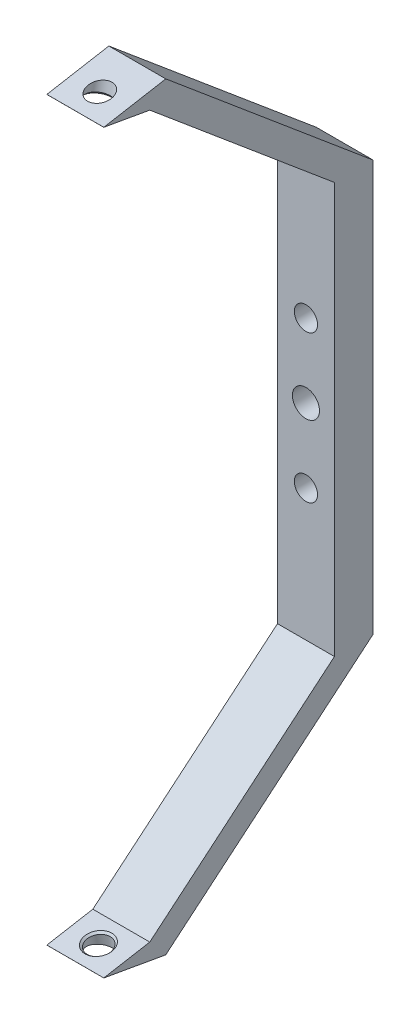
ISO-10303-21;
HEADER;
FILE_DESCRIPTION(('STEP AP214'),'2;1');
FILE_NAME('part.step','',(''),(''),'','','');
FILE_SCHEMA(('AUTOMOTIVE_DESIGN { 1 0 10303 214 1 1 1 1 }'));
ENDSEC;
DATA;
#1=APPLICATION_CONTEXT('core data for automotive mechanical design processes');
#2=APPLICATION_PROTOCOL_DEFINITION('international standard','automotive_design',2000,#1);
#3=PRODUCT_CONTEXT('',#1,'mechanical');
#4=PRODUCT('Part','Part','',(#3));
#5=PRODUCT_RELATED_PRODUCT_CATEGORY('part','',(#4));
#6=PRODUCT_DEFINITION_FORMATION('','',#4);
#7=PRODUCT_DEFINITION_CONTEXT('part definition',#1,'design');
#8=PRODUCT_DEFINITION('design','',#6,#7);
#9=PRODUCT_DEFINITION_SHAPE('','',#8);
#10=(LENGTH_UNIT() NAMED_UNIT(*) SI_UNIT(.MILLI.,.METRE.));
#11=(NAMED_UNIT(*) PLANE_ANGLE_UNIT() SI_UNIT($,.RADIAN.));
#12=(NAMED_UNIT(*) SI_UNIT($,.STERADIAN.) SOLID_ANGLE_UNIT());
#13=UNCERTAINTY_MEASURE_WITH_UNIT(LENGTH_MEASURE(1.E-05),#10,'distance_accuracy_value','');
#14=(GEOMETRIC_REPRESENTATION_CONTEXT(3) GLOBAL_UNCERTAINTY_ASSIGNED_CONTEXT((#13)) GLOBAL_UNIT_ASSIGNED_CONTEXT((#10,
#11,#12)) REPRESENTATION_CONTEXT('',''));
#15=CARTESIAN_POINT('',(0.,0.,0.));
#16=DIRECTION('',(0.,0.,1.));
#17=DIRECTION('',(1.,0.,0.));
#18=AXIS2_PLACEMENT_3D('',#15,#16,#17);
#19=CARTESIAN_POINT('',(3.675,26.5,5.));
#20=DIRECTION('',(-1.,0.,0.));
#21=DIRECTION('',(0.,-1.,0.));
#22=AXIS2_PLACEMENT_3D('',#19,#20,#21);
#23=PLANE('',#22);
#24=DIRECTION('',(0.,1.,0.));
#25=VECTOR('',#24,1.);
#26=CARTESIAN_POINT('',(3.675,26.5,0.));
#27=LINE('',#26,#25);
#28=CARTESIAN_POINT('',(3.675,-26.5,0.));
#29=VERTEX_POINT('',#28);
#30=CARTESIAN_POINT('',(3.675,26.5,0.));
#31=VERTEX_POINT('',#30);
#32=EDGE_CURVE('E241',#29,#31,#27,.T.);
#33=ORIENTED_EDGE('',*,*,#32,.T.);
#34=DIRECTION('',(0.,-0.64278760968654,-0.766044443118977));
#35=VECTOR('',#34,1.);
#36=CARTESIAN_POINT('',(3.675,15.5508383540868,-13.0487027274118));
#37=LINE('',#36,#35);
#38=CARTESIAN_POINT('',(3.67499999999999,48.9620193825305,26.7691922960515));
#39=VERTEX_POINT('',#38);
#40=EDGE_CURVE('E154',#39,#31,#37,.T.);
#41=ORIENTED_EDGE('',*,*,#40,.F.);
#42=DIRECTION('',(0.,0.173648177666936,-0.984807753012207));
#43=VECTOR('',#42,1.);
#44=CARTESIAN_POINT('',(3.67499999999999,52.0634353404395,9.18018835889042));
#45=LINE('',#44,#43);
#46=CARTESIAN_POINT('',(3.67499999999999,47.5514035368628,34.7691922960515));
#47=VERTEX_POINT('',#46);
#48=EDGE_CURVE('E158',#47,#39,#45,.T.);
#49=ORIENTED_EDGE('',*,*,#48,.F.);
#50=CARTESIAN_POINT('',(3.67499999999999,47.5488745389716,34.7687463654891));
#51=DIRECTION('',(1.,0.,0.));
#52=DIRECTION('',(0.,1.,0.));
#53=AXIS2_PLACEMENT_3D('',#50,#51,#52);
#54=CIRCLE('',#53,0.00256801176003775);
#55=CARTESIAN_POINT('',(3.67499999999999,47.5463455410805,34.7691922960515));
#56=VERTEX_POINT('',#55);
#57=EDGE_CURVE('E142',#56,#47,#54,.F.);
#58=ORIENTED_EDGE('',*,*,#57,.F.);
#59=DIRECTION('',(0.,-0.173648177666952,-0.984807753012204));
#60=VECTOR('',#59,1.);
#61=CARTESIAN_POINT('',(3.67499999999999,40.1667657294778,-7.08248452590395));
#62=LINE('',#61,#60);
#63=CARTESIAN_POINT('',(3.67499999999999,46.5,28.8350718518841));
#64=VERTEX_POINT('',#63);
#65=EDGE_CURVE('E146',#56,#64,#62,.T.);
#66=ORIENTED_EDGE('',*,*,#65,.T.);
#67=DIRECTION('',(0.,0.64278760968654,0.766044443118977));
#68=VECTOR('',#67,1.);
#69=CARTESIAN_POINT('',(3.675,13.0888189715563,-10.9828231715791));
#70=LINE('',#69,#68);
#71=CARTESIAN_POINT('',(3.675,26.5,5.));
#72=VERTEX_POINT('',#71);
#73=EDGE_CURVE('E151',#72,#64,#70,.T.);
#74=ORIENTED_EDGE('',*,*,#73,.F.);
#75=DIRECTION('',(0.,1.,0.));
#76=VECTOR('',#75,1.);
#77=CARTESIAN_POINT('',(3.675,26.5,5.));
#78=LINE('',#77,#76);
#79=CARTESIAN_POINT('',(3.675,-26.5,5.));
#80=VERTEX_POINT('',#79);
#81=EDGE_CURVE('E102',#80,#72,#78,.T.);
#82=ORIENTED_EDGE('',*,*,#81,.F.);
#83=DIRECTION('',(0.,-0.64278760968654,0.766044443118977));
#84=VECTOR('',#83,1.);
#85=CARTESIAN_POINT('',(3.67500000000001,-26.5,5.));
#86=LINE('',#85,#84);
#87=CARTESIAN_POINT('',(3.67500000000001,-46.5,28.8350718518841));
#88=VERTEX_POINT('',#87);
#89=EDGE_CURVE('E213',#80,#88,#86,.T.);
#90=ORIENTED_EDGE('',*,*,#89,.T.);
#91=DIRECTION('',(0.,0.173648177666952,-0.984807753012204));
#92=VECTOR('',#91,1.);
#93=CARTESIAN_POINT('',(3.675,-46.5,28.8350718518841));
#94=LINE('',#93,#92);
#95=CARTESIAN_POINT('',(3.675,-47.5463455410805,34.7691922960515));
#96=VERTEX_POINT('',#95);
#97=EDGE_CURVE('E188',#96,#88,#94,.T.);
#98=ORIENTED_EDGE('',*,*,#97,.F.);
#99=CARTESIAN_POINT('',(3.675,-47.5488745389716,34.7687463654891));
#100=DIRECTION('',(-1.,0.,0.));
#101=DIRECTION('',(0.,-1.,0.));
#102=AXIS2_PLACEMENT_3D('',#99,#100,#101);
#103=CIRCLE('',#102,0.00256801176003775);
#104=CARTESIAN_POINT('',(3.675,-47.5514035368628,34.7691922960515));
#105=VERTEX_POINT('',#104);
#106=EDGE_CURVE('E183',#105,#96,#103,.T.);
#107=ORIENTED_EDGE('',*,*,#106,.F.);
#108=DIRECTION('',(0.,-0.173648177666936,-0.984807753012207));
#109=VECTOR('',#108,1.);
#110=CARTESIAN_POINT('',(3.675,-48.9620193825305,26.7691922960515));
#111=LINE('',#110,#109);
#112=CARTESIAN_POINT('',(3.67500000000001,-48.9620193825305,26.7691922960515));
#113=VERTEX_POINT('',#112);
#114=EDGE_CURVE('E180',#105,#113,#111,.T.);
#115=ORIENTED_EDGE('',*,*,#114,.T.);
#116=DIRECTION('',(0.,0.64278760968654,-0.766044443118977));
#117=VECTOR('',#116,1.);
#118=CARTESIAN_POINT('',(3.67500000000001,-48.9620193825305,26.7691922960515));
#119=LINE('',#118,#117);
#120=EDGE_CURVE('E85',#113,#29,#119,.T.);
#121=ORIENTED_EDGE('',*,*,#120,.T.);
#122=EDGE_LOOP('',(#33,#41,#49,#58,#66,#74,#82,#90,#98,#107,#115,#121));
#123=FACE_BOUND('',#122,.T.);
#124=ADVANCED_FACE('F43',(#123),#23,.F.);
#125=CARTESIAN_POINT('',(-3.675,26.5,5.));
#126=DIRECTION('',(1.,0.,0.));
#127=DIRECTION('',(0.,1.,0.));
#128=AXIS2_PLACEMENT_3D('',#125,#126,#127);
#129=PLANE('',#128);
#130=DIRECTION('',(0.,-1.,0.));
#131=VECTOR('',#130,1.);
#132=CARTESIAN_POINT('',(-3.675,26.5,0.));
#133=LINE('',#132,#131);
#134=CARTESIAN_POINT('',(-3.675,26.5,0.));
#135=VERTEX_POINT('',#134);
#136=CARTESIAN_POINT('',(-3.675,-26.5,0.));
#137=VERTEX_POINT('',#136);
#138=EDGE_CURVE('E74',#135,#137,#133,.T.);
#139=ORIENTED_EDGE('',*,*,#138,.T.);
#140=DIRECTION('',(0.,0.64278760968654,-0.766044443118977));
#141=VECTOR('',#140,1.);
#142=CARTESIAN_POINT('',(-3.675,-48.9620193825305,26.7691922960515));
#143=LINE('',#142,#141);
#144=CARTESIAN_POINT('',(-3.675,-48.9620193825305,26.7691922960515));
#145=VERTEX_POINT('',#144);
#146=EDGE_CURVE('E192',#145,#137,#143,.T.);
#147=ORIENTED_EDGE('',*,*,#146,.F.);
#148=DIRECTION('',(0.,0.173648177666936,0.984807753012207));
#149=VECTOR('',#148,1.);
#150=CARTESIAN_POINT('',(-3.675,-48.9620193825305,26.7691922960515));
#151=LINE('',#150,#149);
#152=CARTESIAN_POINT('',(-3.675,-47.5514035368628,34.7691922960515));
#153=VERTEX_POINT('',#152);
#154=EDGE_CURVE('E200',#145,#153,#151,.T.);
#155=ORIENTED_EDGE('',*,*,#154,.T.);
#156=CARTESIAN_POINT('',(-3.675,-47.5488745389716,34.7687463654891));
#157=DIRECTION('',(1.,0.,0.));
#158=DIRECTION('',(0.,1.,0.));
#159=AXIS2_PLACEMENT_3D('',#156,#157,#158);
#160=CIRCLE('',#159,0.00256801176003775);
#161=CARTESIAN_POINT('',(-3.675,-47.5463455410805,34.7691922960515));
#162=VERTEX_POINT('',#161);
#163=EDGE_CURVE('E196',#162,#153,#160,.T.);
#164=ORIENTED_EDGE('',*,*,#163,.F.);
#165=DIRECTION('',(0.,-0.173648177666952,0.984807753012204));
#166=VECTOR('',#165,1.);
#167=CARTESIAN_POINT('',(-3.675,-46.5,28.8350718518841));
#168=LINE('',#167,#166);
#169=CARTESIAN_POINT('',(-3.675,-46.5,28.8350718518841));
#170=VERTEX_POINT('',#169);
#171=EDGE_CURVE('E179',#170,#162,#168,.T.);
#172=ORIENTED_EDGE('',*,*,#171,.F.);
#173=DIRECTION('',(0.,-0.64278760968654,0.766044443118977));
#174=VECTOR('',#173,1.);
#175=CARTESIAN_POINT('',(-3.675,-26.5,5.));
#176=LINE('',#175,#174);
#177=CARTESIAN_POINT('',(-3.675,-26.5,5.));
#178=VERTEX_POINT('',#177);
#179=EDGE_CURVE('E119',#178,#170,#176,.T.);
#180=ORIENTED_EDGE('',*,*,#179,.F.);
#181=DIRECTION('',(0.,-1.,0.));
#182=VECTOR('',#181,1.);
#183=CARTESIAN_POINT('',(-3.675,26.5,5.));
#184=LINE('',#183,#182);
#185=CARTESIAN_POINT('',(-3.675,26.5,5.));
#186=VERTEX_POINT('',#185);
#187=EDGE_CURVE('E101',#186,#178,#184,.T.);
#188=ORIENTED_EDGE('',*,*,#187,.F.);
#189=DIRECTION('',(0.,0.64278760968654,0.766044443118977));
#190=VECTOR('',#189,1.);
#191=CARTESIAN_POINT('',(-3.675,13.0888189715563,-10.9828231715791));
#192=LINE('',#191,#190);
#193=CARTESIAN_POINT('',(-3.67500000000001,46.5,28.8350718518841));
#194=VERTEX_POINT('',#193);
#195=EDGE_CURVE('E115',#186,#194,#192,.T.);
#196=ORIENTED_EDGE('',*,*,#195,.T.);
#197=DIRECTION('',(0.,-0.173648177666952,-0.984807753012204));
#198=VECTOR('',#197,1.);
#199=CARTESIAN_POINT('',(-3.67500000000001,40.1667657294778,-7.08248452590395));
#200=LINE('',#199,#198);
#201=CARTESIAN_POINT('',(-3.67500000000001,47.5463455410805,34.7691922960515));
#202=VERTEX_POINT('',#201);
#203=EDGE_CURVE('E128',#202,#194,#200,.T.);
#204=ORIENTED_EDGE('',*,*,#203,.F.);
#205=CARTESIAN_POINT('',(-3.67500000000001,47.5488745389716,34.7687463654891));
#206=DIRECTION('',(1.,0.,0.));
#207=DIRECTION('',(0.,1.,0.));
#208=AXIS2_PLACEMENT_3D('',#205,#206,#207);
#209=CIRCLE('',#208,0.00256801176003775);
#210=CARTESIAN_POINT('',(-3.67500000000001,47.5514035368628,34.7691922960515));
#211=VERTEX_POINT('',#210);
#212=EDGE_CURVE('E134',#202,#211,#209,.F.);
#213=ORIENTED_EDGE('',*,*,#212,.T.);
#214=DIRECTION('',(0.,0.173648177666936,-0.984807753012207));
#215=VECTOR('',#214,1.);
#216=CARTESIAN_POINT('',(-3.67500000000001,52.0634353404395,9.18018835889042));
#217=LINE('',#216,#215);
#218=CARTESIAN_POINT('',(-3.67500000000001,48.9620193825305,26.7691922960515));
#219=VERTEX_POINT('',#218);
#220=EDGE_CURVE('E132',#211,#219,#217,.T.);
#221=ORIENTED_EDGE('',*,*,#220,.T.);
#222=DIRECTION('',(0.,-0.64278760968654,-0.766044443118977));
#223=VECTOR('',#222,1.);
#224=CARTESIAN_POINT('',(-3.675,15.5508383540868,-13.0487027274118));
#225=LINE('',#224,#223);
#226=EDGE_CURVE('E127',#219,#135,#225,.T.);
#227=ORIENTED_EDGE('',*,*,#226,.T.);
#228=EDGE_LOOP('',(#139,#147,#155,#164,#172,#180,#188,#196,#204,#213,#221,#227));
#229=FACE_BOUND('',#228,.T.);
#230=ADVANCED_FACE('F112',(#229),#129,.F.);
#231=CARTESIAN_POINT('',(0.,0.,5.));
#232=DIRECTION('',(0.,0.,1.));
#233=DIRECTION('',(1.,0.,0.));
#234=AXIS2_PLACEMENT_3D('',#231,#232,#233);
#235=PLANE('',#234);
#236=CARTESIAN_POINT('',(0.,0.,5.));
#237=DIRECTION('',(0.,0.,1.));
#238=DIRECTION('',(1.,0.,0.));
#239=AXIS2_PLACEMENT_3D('',#236,#237,#238);
#240=CIRCLE('',#239,1.75);
#241=CARTESIAN_POINT('',(1.75,0.,5.));
#242=VERTEX_POINT('',#241);
#243=EDGE_CURVE('E228',#242,#242,#240,.T.);
#244=ORIENTED_EDGE('',*,*,#243,.F.);
#245=EDGE_LOOP('',(#244));
#246=FACE_BOUND('',#245,.T.);
#247=CARTESIAN_POINT('',(0.,9.50000000000002,5.));
#248=DIRECTION('',(0.,0.,-1.));
#249=DIRECTION('',(-1.,0.,0.));
#250=AXIS2_PLACEMENT_3D('',#247,#248,#249);
#251=CIRCLE('',#250,1.49999999999999);
#252=CARTESIAN_POINT('',(-1.49999999999998,9.50000000000002,5.));
#253=VERTEX_POINT('',#252);
#254=EDGE_CURVE('E237',#253,#253,#251,.T.);
#255=ORIENTED_EDGE('',*,*,#254,.T.);
#256=EDGE_LOOP('',(#255));
#257=FACE_BOUND('',#256,.T.);
#258=CARTESIAN_POINT('',(0.,-9.49999999999997,5.));
#259=DIRECTION('',(0.,0.,-1.));
#260=DIRECTION('',(-1.,0.,0.));
#261=AXIS2_PLACEMENT_3D('',#258,#259,#260);
#262=CIRCLE('',#261,1.5);
#263=CARTESIAN_POINT('',(-1.5,-9.49999999999997,5.));
#264=VERTEX_POINT('',#263);
#265=EDGE_CURVE('E246',#264,#264,#262,.T.);
#266=ORIENTED_EDGE('',*,*,#265,.T.);
#267=EDGE_LOOP('',(#266));
#268=FACE_BOUND('',#267,.T.);
#269=ORIENTED_EDGE('',*,*,#81,.T.);
#270=DIRECTION('',(-1.,0.,0.));
#271=VECTOR('',#270,1.);
#272=CARTESIAN_POINT('',(-3.675,26.5,5.));
#273=LINE('',#272,#271);
#274=EDGE_CURVE('E98',#72,#186,#273,.T.);
#275=ORIENTED_EDGE('',*,*,#274,.T.);
#276=ORIENTED_EDGE('',*,*,#187,.T.);
#277=DIRECTION('',(1.,0.,0.));
#278=VECTOR('',#277,1.);
#279=CARTESIAN_POINT('',(-3.675,-26.5,5.));
#280=LINE('',#279,#278);
#281=EDGE_CURVE('E62',#178,#80,#280,.T.);
#282=ORIENTED_EDGE('',*,*,#281,.T.);
#283=EDGE_LOOP('',(#269,#275,#276,#282));
#284=FACE_BOUND('',#283,.T.);
#285=ADVANCED_FACE('F100',(#246,#257,#268,#284),#235,.T.);
#286=CARTESIAN_POINT('',(0.,0.,0.));
#287=DIRECTION('',(0.,0.,1.));
#288=DIRECTION('',(1.,0.,0.));
#289=AXIS2_PLACEMENT_3D('',#286,#287,#288);
#290=PLANE('',#289);
#291=CARTESIAN_POINT('',(0.,0.,0.));
#292=DIRECTION('',(0.,0.,1.));
#293=DIRECTION('',(1.,0.,0.));
#294=AXIS2_PLACEMENT_3D('',#291,#292,#293);
#295=CIRCLE('',#294,1.75);
#296=CARTESIAN_POINT('',(1.75,0.,0.));
#297=VERTEX_POINT('',#296);
#298=EDGE_CURVE('E229',#297,#297,#295,.T.);
#299=ORIENTED_EDGE('',*,*,#298,.T.);
#300=EDGE_LOOP('',(#299));
#301=FACE_BOUND('',#300,.T.);
#302=CARTESIAN_POINT('',(0.,9.50000000000002,0.));
#303=DIRECTION('',(0.,0.,-1.));
#304=DIRECTION('',(-1.,0.,0.));
#305=AXIS2_PLACEMENT_3D('',#302,#303,#304);
#306=CIRCLE('',#305,1.49999999999999);
#307=CARTESIAN_POINT('',(-1.49999999999998,9.50000000000002,0.));
#308=VERTEX_POINT('',#307);
#309=EDGE_CURVE('E242',#308,#308,#306,.T.);
#310=ORIENTED_EDGE('',*,*,#309,.F.);
#311=EDGE_LOOP('',(#310));
#312=FACE_BOUND('',#311,.T.);
#313=CARTESIAN_POINT('',(0.,-9.49999999999997,0.));
#314=DIRECTION('',(0.,0.,-1.));
#315=DIRECTION('',(-1.,0.,0.));
#316=AXIS2_PLACEMENT_3D('',#313,#314,#315);
#317=CIRCLE('',#316,1.5);
#318=CARTESIAN_POINT('',(-1.5,-9.49999999999997,0.));
#319=VERTEX_POINT('',#318);
#320=EDGE_CURVE('E233',#319,#319,#317,.T.);
#321=ORIENTED_EDGE('',*,*,#320,.F.);
#322=EDGE_LOOP('',(#321));
#323=FACE_BOUND('',#322,.T.);
#324=ORIENTED_EDGE('',*,*,#32,.F.);
#325=DIRECTION('',(1.,0.,0.));
#326=VECTOR('',#325,1.);
#327=CARTESIAN_POINT('',(-3.675,-26.5,0.));
#328=LINE('',#327,#326);
#329=EDGE_CURVE('E254',#137,#29,#328,.T.);
#330=ORIENTED_EDGE('',*,*,#329,.F.);
#331=ORIENTED_EDGE('',*,*,#138,.F.);
#332=DIRECTION('',(-1.,0.,0.));
#333=VECTOR('',#332,1.);
#334=CARTESIAN_POINT('',(-3.675,26.5,0.));
#335=LINE('',#334,#333);
#336=EDGE_CURVE('E262',#31,#135,#335,.T.);
#337=ORIENTED_EDGE('',*,*,#336,.F.);
#338=EDGE_LOOP('',(#324,#330,#331,#337));
#339=FACE_BOUND('',#338,.T.);
#340=ADVANCED_FACE('F304',(#301,#312,#323,#339),#290,.F.);
#341=CARTESIAN_POINT('',(0.,-9.49999999999997,5.));
#342=DIRECTION('',(0.,0.,-1.));
#343=DIRECTION('',(-1.,0.,0.));
#344=AXIS2_PLACEMENT_3D('',#341,#342,#343);
#345=CYLINDRICAL_SURFACE('',#344,1.5);
#346=ORIENTED_EDGE('',*,*,#265,.F.);
#347=EDGE_LOOP('',(#346));
#348=FACE_BOUND('',#347,.T.);
#349=ORIENTED_EDGE('',*,*,#320,.T.);
#350=EDGE_LOOP('',(#349));
#351=FACE_BOUND('',#350,.T.);
#352=ADVANCED_FACE('F307',(#348,#351),#345,.F.);
#353=CARTESIAN_POINT('',(0.,9.50000000000002,5.));
#354=DIRECTION('',(0.,0.,-1.));
#355=DIRECTION('',(-1.,0.,0.));
#356=AXIS2_PLACEMENT_3D('',#353,#354,#355);
#357=CYLINDRICAL_SURFACE('',#356,1.49999999999999);
#358=ORIENTED_EDGE('',*,*,#254,.F.);
#359=EDGE_LOOP('',(#358));
#360=FACE_BOUND('',#359,.T.);
#361=ORIENTED_EDGE('',*,*,#309,.T.);
#362=EDGE_LOOP('',(#361));
#363=FACE_BOUND('',#362,.T.);
#364=ADVANCED_FACE('F314',(#360,#363),#357,.F.);
#365=CARTESIAN_POINT('',(0.,0.,0.));
#366=DIRECTION('',(0.,0.,1.));
#367=DIRECTION('',(1.,0.,0.));
#368=AXIS2_PLACEMENT_3D('',#365,#366,#367);
#369=CYLINDRICAL_SURFACE('',#368,1.75);
#370=ORIENTED_EDGE('',*,*,#298,.F.);
#371=EDGE_LOOP('',(#370));
#372=FACE_BOUND('',#371,.T.);
#373=ORIENTED_EDGE('',*,*,#243,.T.);
#374=EDGE_LOOP('',(#373));
#375=FACE_BOUND('',#374,.T.);
#376=ADVANCED_FACE('F318',(#372,#375),#369,.F.);
#377=CARTESIAN_POINT('',(3.67500000000001,-48.9620193825305,26.7691922960515));
#378=DIRECTION('',(0.,0.766044443118977,0.64278760968654));
#379=DIRECTION('',(0.,-0.64278760968654,0.766044443118977));
#380=AXIS2_PLACEMENT_3D('',#377,#378,#379);
#381=PLANE('',#380);
#382=ORIENTED_EDGE('',*,*,#146,.T.);
#383=ORIENTED_EDGE('',*,*,#329,.T.);
#384=ORIENTED_EDGE('',*,*,#120,.F.);
#385=DIRECTION('',(-1.,0.,0.));
#386=VECTOR('',#385,1.);
#387=CARTESIAN_POINT('',(3.67500000000001,-48.9620193825305,26.7691922960515));
#388=LINE('',#387,#386);
#389=EDGE_CURVE('E216',#113,#145,#388,.T.);
#390=ORIENTED_EDGE('',*,*,#389,.T.);
#391=EDGE_LOOP('',(#382,#383,#384,#390));
#392=FACE_BOUND('',#391,.T.);
#393=ADVANCED_FACE('F322',(#392),#381,.F.);
#394=CARTESIAN_POINT('',(3.67500000000001,-26.5,5.));
#395=DIRECTION('',(0.,-0.766044443118977,-0.64278760968654));
#396=DIRECTION('',(0.,0.64278760968654,-0.766044443118977));
#397=AXIS2_PLACEMENT_3D('',#394,#395,#396);
#398=PLANE('',#397);
#399=ORIENTED_EDGE('',*,*,#179,.T.);
#400=DIRECTION('',(-1.,0.,0.));
#401=VECTOR('',#400,1.);
#402=CARTESIAN_POINT('',(3.67500000000001,-46.5,28.8350718518841));
#403=LINE('',#402,#401);
#404=EDGE_CURVE('E224',#88,#170,#403,.T.);
#405=ORIENTED_EDGE('',*,*,#404,.F.);
#406=ORIENTED_EDGE('',*,*,#89,.F.);
#407=ORIENTED_EDGE('',*,*,#281,.F.);
#408=EDGE_LOOP('',(#399,#405,#406,#407));
#409=FACE_BOUND('',#408,.T.);
#410=ADVANCED_FACE('F326',(#409),#398,.F.);
#411=CARTESIAN_POINT('',(12.0473053720196,-46.5,28.8350718518841));
#412=DIRECTION('',(0.,-0.984807753012204,-0.173648177666952));
#413=DIRECTION('',(0.,0.173648177666952,-0.984807753012204));
#414=AXIS2_PLACEMENT_3D('',#411,#412,#413);
#415=PLANE('',#414);
#416=CARTESIAN_POINT('',(0.,-47.0209445330009,31.7894951109207));
#417=DIRECTION('',(0.,-0.984807753012204,-0.173648177666952));
#418=DIRECTION('',(0.,0.173648177666952,-0.984807753012204));
#419=AXIS2_PLACEMENT_3D('',#416,#417,#418);
#420=CIRCLE('',#419,1.74999999999894);
#421=CARTESIAN_POINT('',(0.,-46.7170602220839,30.0660815431504));
#422=VERTEX_POINT('',#421);
#423=EDGE_CURVE('E273',#422,#422,#420,.T.);
#424=ORIENTED_EDGE('',*,*,#423,.T.);
#425=EDGE_LOOP('',(#424));
#426=FACE_BOUND('',#425,.T.);
#427=DIRECTION('',(-1.,0.,0.));
#428=VECTOR('',#427,1.);
#429=CARTESIAN_POINT('',(12.0473053720196,-47.5463455410805,34.7691922960515));
#430=LINE('',#429,#428);
#431=EDGE_CURVE('E184',#96,#162,#430,.T.);
#432=ORIENTED_EDGE('',*,*,#431,.F.);
#433=ORIENTED_EDGE('',*,*,#97,.T.);
#434=ORIENTED_EDGE('',*,*,#404,.T.);
#435=ORIENTED_EDGE('',*,*,#171,.T.);
#436=EDGE_LOOP('',(#432,#433,#434,#435));
#437=FACE_BOUND('',#436,.T.);
#438=ADVANCED_FACE('F329',(#426,#437),#415,.F.);
#439=CARTESIAN_POINT('',(12.0473053720196,-47.5488745389716,34.7687463654891));
#440=DIRECTION('',(-1.,0.,0.));
#441=DIRECTION('',(0.,-1.,0.));
#442=AXIS2_PLACEMENT_3D('',#439,#440,#441);
#443=CYLINDRICAL_SURFACE('',#442,0.00256801176003775);
#444=DIRECTION('',(-1.,0.,0.));
#445=VECTOR('',#444,1.);
#446=CARTESIAN_POINT('',(12.0473053720196,-47.5514035368628,34.7691922960515));
#447=LINE('',#446,#445);
#448=EDGE_CURVE('E204',#105,#153,#447,.T.);
#449=ORIENTED_EDGE('',*,*,#448,.F.);
#450=ORIENTED_EDGE('',*,*,#106,.T.);
#451=ORIENTED_EDGE('',*,*,#431,.T.);
#452=ORIENTED_EDGE('',*,*,#163,.T.);
#453=EDGE_LOOP('',(#449,#450,#451,#452));
#454=FACE_BOUND('',#453,.T.);
#455=ADVANCED_FACE('F333',(#454),#443,.T.);
#456=CARTESIAN_POINT('',(12.0473053720196,-48.9620193825305,26.7691922960515));
#457=DIRECTION('',(0.,-0.984807753012207,0.173648177666936));
#458=DIRECTION('',(0.,-0.173648177666936,-0.984807753012207));
#459=AXIS2_PLACEMENT_3D('',#456,#457,#458);
#460=PLANE('',#459);
#461=CARTESIAN_POINT('',(0.,-48.1106859167488,31.5973443029714));
#462=DIRECTION('',(0.,-0.984807753012207,0.173648177666936));
#463=DIRECTION('',(0.,0.173648177666936,0.984807753012207));
#464=AXIS2_PLACEMENT_3D('',#461,#462,#463);
#465=ELLIPSE('',#464,1.59626665871387,1.5);
#466=CARTESIAN_POINT('',(0.,-47.8334971203926,33.1693600843477));
#467=VERTEX_POINT('',#466);
#468=EDGE_CURVE('E166',#467,#467,#465,.F.);
#469=ORIENTED_EDGE('',*,*,#468,.T.);
#470=EDGE_LOOP('',(#469));
#471=FACE_BOUND('',#470,.T.);
#472=ORIENTED_EDGE('',*,*,#114,.F.);
#473=ORIENTED_EDGE('',*,*,#448,.T.);
#474=ORIENTED_EDGE('',*,*,#154,.F.);
#475=ORIENTED_EDGE('',*,*,#389,.F.);
#476=EDGE_LOOP('',(#472,#473,#474,#475));
#477=FACE_BOUND('',#476,.T.);
#478=ADVANCED_FACE('F337',(#471,#477),#460,.T.);
#479=CARTESIAN_POINT('',(0.,-52.4229446759958,30.8369767359198));
#480=DIRECTION('',(0.,0.984807753012209,0.173648177666928));
#481=DIRECTION('',(0.,-0.173648177666928,0.984807753012209));
#482=AXIS2_PLACEMENT_3D('',#479,#480,#481);
#483=CYLINDRICAL_SURFACE('',#482,1.5);
#484=CARTESIAN_POINT('',(0.,-47.2671464712529,31.7460830665042));
#485=DIRECTION('',(0.,-0.984807753012209,-0.173648177666927));
#486=DIRECTION('',(0.,0.173648177666927,-0.984807753012209));
#487=AXIS2_PLACEMENT_3D('',#484,#485,#486);
#488=CIRCLE('',#487,1.5);
#489=CARTESIAN_POINT('',(0.,-47.0066742047525,30.2688714369859));
#490=VERTEX_POINT('',#489);
#491=EDGE_CURVE('E258',#490,#490,#488,.F.);
#492=ORIENTED_EDGE('',*,*,#491,.T.);
#493=EDGE_LOOP('',(#492));
#494=FACE_BOUND('',#493,.T.);
#495=ORIENTED_EDGE('',*,*,#468,.F.);
#496=EDGE_LOOP('',(#495));
#497=FACE_BOUND('',#496,.T.);
#498=ADVANCED_FACE('F341',(#494,#497),#483,.F.);
#499=CARTESIAN_POINT('',(-3.67500000000001,47.5488745389716,34.7687463654891));
#500=DIRECTION('',(1.,0.,0.));
#501=DIRECTION('',(0.,1.,0.));
#502=AXIS2_PLACEMENT_3D('',#499,#500,#501);
#503=CYLINDRICAL_SURFACE('',#502,0.00256801176003775);
#504=ORIENTED_EDGE('',*,*,#57,.T.);
#505=DIRECTION('',(1.,0.,0.));
#506=VECTOR('',#505,1.);
#507=CARTESIAN_POINT('',(-3.67500000000001,47.5514035368628,34.7691922960515));
#508=LINE('',#507,#506);
#509=EDGE_CURVE('E162',#211,#47,#508,.T.);
#510=ORIENTED_EDGE('',*,*,#509,.F.);
#511=ORIENTED_EDGE('',*,*,#212,.F.);
#512=DIRECTION('',(1.,0.,0.));
#513=VECTOR('',#512,1.);
#514=CARTESIAN_POINT('',(-3.67500000000001,47.5463455410805,34.7691922960515));
#515=LINE('',#514,#513);
#516=EDGE_CURVE('E141',#202,#56,#515,.T.);
#517=ORIENTED_EDGE('',*,*,#516,.T.);
#518=EDGE_LOOP('',(#504,#510,#511,#517));
#519=FACE_BOUND('',#518,.T.);
#520=ADVANCED_FACE('F345',(#519),#503,.T.);
#521=CARTESIAN_POINT('',(-3.67500000000001,52.0634353404395,9.18018835889042));
#522=DIRECTION('',(0.,-0.984807753012207,-0.173648177666936));
#523=DIRECTION('',(0.,0.173648177666936,-0.984807753012207));
#524=AXIS2_PLACEMENT_3D('',#521,#522,#523);
#525=PLANE('',#524);
#526=CARTESIAN_POINT('',(0.,48.1083146758876,31.6107922781577));
#527=DIRECTION('',(0.,-0.984807753012207,-0.173648177666936));
#528=DIRECTION('',(0.,-0.173648177666936,0.984807753012207));
#529=AXIS2_PLACEMENT_3D('',#526,#527,#528);
#530=ELLIPSE('',#529,1.59626665871388,1.5);
#531=CARTESIAN_POINT('',(0.,47.8311258795314,33.182808059534));
#532=VERTEX_POINT('',#531);
#533=EDGE_CURVE('E147',#532,#532,#530,.T.);
#534=ORIENTED_EDGE('',*,*,#533,.T.);
#535=EDGE_LOOP('',(#534));
#536=FACE_BOUND('',#535,.T.);
#537=ORIENTED_EDGE('',*,*,#48,.T.);
#538=DIRECTION('',(1.,0.,0.));
#539=VECTOR('',#538,1.);
#540=CARTESIAN_POINT('',(-3.67500000000001,48.9620193825305,26.7691922960515));
#541=LINE('',#540,#539);
#542=EDGE_CURVE('E167',#219,#39,#541,.T.);
#543=ORIENTED_EDGE('',*,*,#542,.F.);
#544=ORIENTED_EDGE('',*,*,#220,.F.);
#545=ORIENTED_EDGE('',*,*,#509,.T.);
#546=EDGE_LOOP('',(#537,#543,#544,#545));
#547=FACE_BOUND('',#546,.T.);
#548=ADVANCED_FACE('F349',(#536,#547),#525,.F.);
#549=CARTESIAN_POINT('',(-3.675,15.5508383540868,-13.0487027274118));
#550=DIRECTION('',(0.,-0.766044443118977,0.64278760968654));
#551=DIRECTION('',(0.,-0.64278760968654,-0.766044443118977));
#552=AXIS2_PLACEMENT_3D('',#549,#550,#551);
#553=PLANE('',#552);
#554=ORIENTED_EDGE('',*,*,#40,.T.);
#555=ORIENTED_EDGE('',*,*,#336,.T.);
#556=ORIENTED_EDGE('',*,*,#226,.F.);
#557=ORIENTED_EDGE('',*,*,#542,.T.);
#558=EDGE_LOOP('',(#554,#555,#556,#557));
#559=FACE_BOUND('',#558,.T.);
#560=ADVANCED_FACE('F357',(#559),#553,.F.);
#561=CARTESIAN_POINT('',(-3.675,13.0888189715563,-10.9828231715791));
#562=DIRECTION('',(0.,0.766044443118977,-0.64278760968654));
#563=DIRECTION('',(0.,0.64278760968654,0.766044443118977));
#564=AXIS2_PLACEMENT_3D('',#561,#562,#563);
#565=PLANE('',#564);
#566=ORIENTED_EDGE('',*,*,#73,.T.);
#567=DIRECTION('',(1.,0.,0.));
#568=VECTOR('',#567,1.);
#569=CARTESIAN_POINT('',(-3.67500000000001,46.5,28.8350718518841));
#570=LINE('',#569,#568);
#571=EDGE_CURVE('E124',#194,#64,#570,.T.);
#572=ORIENTED_EDGE('',*,*,#571,.F.);
#573=ORIENTED_EDGE('',*,*,#195,.F.);
#574=ORIENTED_EDGE('',*,*,#274,.F.);
#575=EDGE_LOOP('',(#566,#572,#573,#574));
#576=FACE_BOUND('',#575,.T.);
#577=ADVANCED_FACE('F122',(#576),#565,.F.);
#578=CARTESIAN_POINT('',(-3.67500000000001,40.1667657294778,-7.08248452590395));
#579=DIRECTION('',(0.,-0.984807753012204,0.173648177666952));
#580=DIRECTION('',(0.,-0.173648177666952,-0.984807753012204));
#581=AXIS2_PLACEMENT_3D('',#578,#579,#580);
#582=PLANE('',#581);
#583=CARTESIAN_POINT('',(0.,47.0231727705403,31.8021320739678));
#584=DIRECTION('',(0.,-0.984807753012204,0.173648177666952));
#585=DIRECTION('',(0.,-0.173648177666952,-0.984807753012204));
#586=AXIS2_PLACEMENT_3D('',#583,#584,#585);
#587=CIRCLE('',#586,1.74999999999997);
#588=CARTESIAN_POINT('',(0.,46.7192884596231,30.0787185061965));
#589=VERTEX_POINT('',#588);
#590=EDGE_CURVE('E11',#589,#589,#587,.F.);
#591=ORIENTED_EDGE('',*,*,#590,.T.);
#592=EDGE_LOOP('',(#591));
#593=FACE_BOUND('',#592,.T.);
#594=ORIENTED_EDGE('',*,*,#65,.F.);
#595=ORIENTED_EDGE('',*,*,#516,.F.);
#596=ORIENTED_EDGE('',*,*,#203,.T.);
#597=ORIENTED_EDGE('',*,*,#571,.T.);
#598=EDGE_LOOP('',(#594,#595,#596,#597));
#599=FACE_BOUND('',#598,.T.);
#600=ADVANCED_FACE('F351',(#593,#599),#582,.T.);
#601=CARTESIAN_POINT('',(0.,54.26150975518,30.5258179681157));
#602=DIRECTION('',(0.,-0.984807753012204,0.173648177666952));
#603=DIRECTION('',(0.,-0.173648177666952,-0.984807753012204));
#604=AXIS2_PLACEMENT_3D('',#601,#602,#603);
#605=CYLINDRICAL_SURFACE('',#604,1.5);
#606=CARTESIAN_POINT('',(0.,47.2693747087933,31.7587200295511));
#607=DIRECTION('',(0.,-0.984807753012202,0.173648177666966));
#608=DIRECTION('',(0.,-0.173648177666966,-0.984807753012202));
#609=AXIS2_PLACEMENT_3D('',#606,#607,#608);
#610=CIRCLE('',#609,1.5);
#611=CARTESIAN_POINT('',(0.,47.0089024422929,30.2815084000328));
#612=VERTEX_POINT('',#611);
#613=EDGE_CURVE('E54',#612,#612,#610,.T.);
#614=ORIENTED_EDGE('',*,*,#613,.T.);
#615=EDGE_LOOP('',(#614));
#616=FACE_BOUND('',#615,.T.);
#617=ORIENTED_EDGE('',*,*,#533,.F.);
#618=EDGE_LOOP('',(#617));
#619=FACE_BOUND('',#618,.T.);
#620=ADVANCED_FACE('F280',(#616,#619),#605,.F.);
#621=CARTESIAN_POINT('',(0.,-47.2671464712529,31.7460830665042));
#622=DIRECTION('',(0.,0.984807753012209,0.173648177666927));
#623=DIRECTION('',(0.,-0.173648177666927,0.984807753012209));
#624=AXIS2_PLACEMENT_3D('',#621,#622,#623);
#625=CONICAL_SURFACE('',#624,1.5,0.785398163397464);
#626=ORIENTED_EDGE('',*,*,#423,.F.);
#627=EDGE_LOOP('',(#626));
#628=FACE_BOUND('',#627,.T.);
#629=ORIENTED_EDGE('',*,*,#491,.F.);
#630=EDGE_LOOP('',(#629));
#631=FACE_BOUND('',#630,.T.);
#632=ADVANCED_FACE('F284',(#628,#631),#625,.F.);
#633=CARTESIAN_POINT('',(0.,47.2693747087933,31.7587200295511));
#634=DIRECTION('',(0.,-0.984807753012202,0.173648177666966));
#635=DIRECTION('',(0.,-0.173648177666966,-0.984807753012202));
#636=AXIS2_PLACEMENT_3D('',#633,#634,#635);
#637=CONICAL_SURFACE('',#636,1.5,0.785398163397465);
#638=ORIENTED_EDGE('',*,*,#590,.F.);
#639=EDGE_LOOP('',(#638));
#640=FACE_BOUND('',#639,.T.);
#641=ORIENTED_EDGE('',*,*,#613,.F.);
#642=EDGE_LOOP('',(#641));
#643=FACE_BOUND('',#642,.T.);
#644=ADVANCED_FACE('F46',(#640,#643),#637,.F.);
#645=CLOSED_SHELL('',(#124,#230,#285,#340,#352,#364,#376,#393,#410,#438,#455,#478,#498,#520,
#548,#560,#577,#600,#620,#632,#644));
#646=MANIFOLD_SOLID_BREP('B2',#645);
#647=ADVANCED_BREP_SHAPE_REPRESENTATION('',(#18,#646),#14);
#648=SHAPE_DEFINITION_REPRESENTATION(#9,#647);
ENDSEC;
END-ISO-10303-21;
